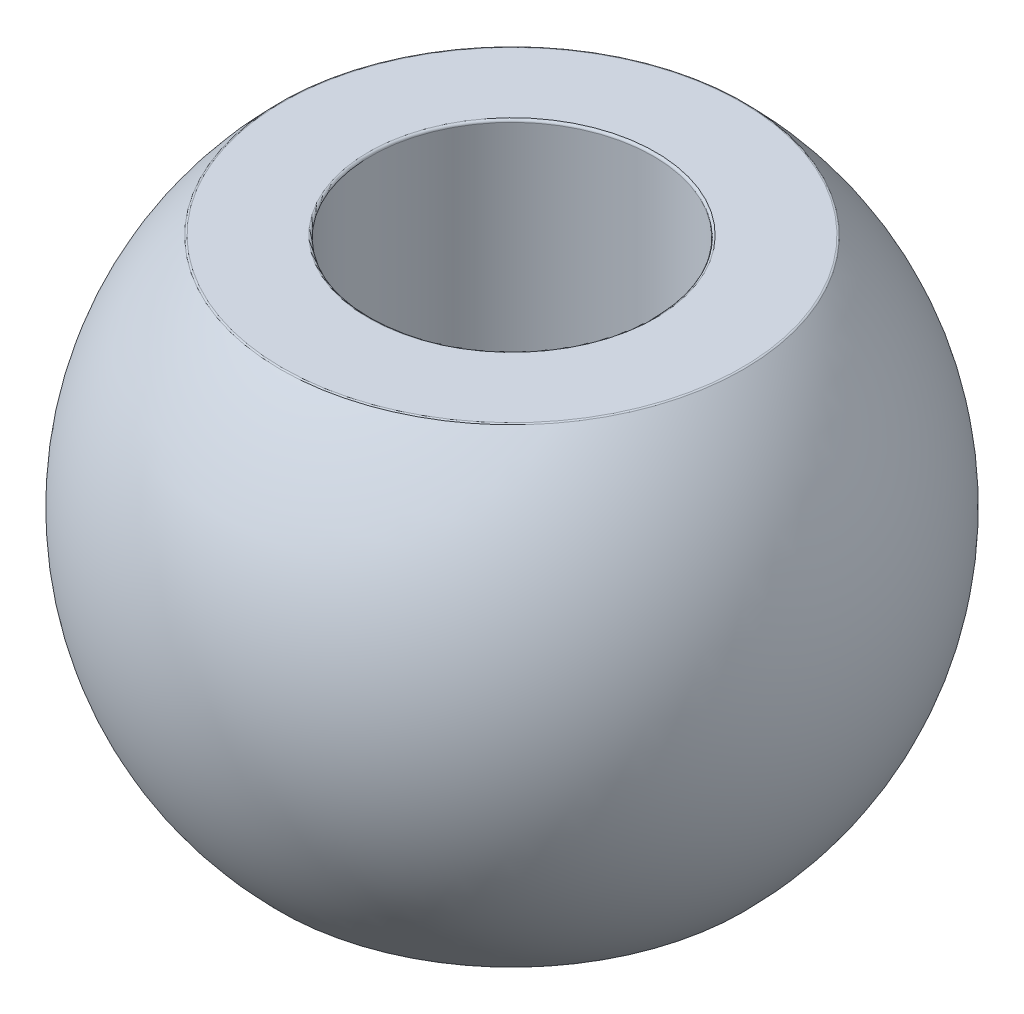
ISO-10303-21;
HEADER;
FILE_DESCRIPTION(('STEP AP214'),'2;1');
FILE_NAME('part.step','',(''),(''),'','','');
FILE_SCHEMA(('AUTOMOTIVE_DESIGN { 1 0 10303 214 1 1 1 1 }'));
ENDSEC;
DATA;
#1=APPLICATION_CONTEXT('core data for automotive mechanical design processes');
#2=APPLICATION_PROTOCOL_DEFINITION('international standard','automotive_design',2000,#1);
#3=PRODUCT_CONTEXT('',#1,'mechanical');
#4=PRODUCT('Part','Part','',(#3));
#5=PRODUCT_RELATED_PRODUCT_CATEGORY('part','',(#4));
#6=PRODUCT_DEFINITION_FORMATION('','',#4);
#7=PRODUCT_DEFINITION_CONTEXT('part definition',#1,'design');
#8=PRODUCT_DEFINITION('design','',#6,#7);
#9=PRODUCT_DEFINITION_SHAPE('','',#8);
#10=(LENGTH_UNIT() NAMED_UNIT(*) SI_UNIT(.MILLI.,.METRE.));
#11=(NAMED_UNIT(*) PLANE_ANGLE_UNIT() SI_UNIT($,.RADIAN.));
#12=(NAMED_UNIT(*) SI_UNIT($,.STERADIAN.) SOLID_ANGLE_UNIT());
#13=UNCERTAINTY_MEASURE_WITH_UNIT(LENGTH_MEASURE(1.E-05),#10,'distance_accuracy_value','');
#14=(GEOMETRIC_REPRESENTATION_CONTEXT(3) GLOBAL_UNCERTAINTY_ASSIGNED_CONTEXT((#13)) GLOBAL_UNIT_ASSIGNED_CONTEXT((#10,
#11,#12)) REPRESENTATION_CONTEXT('',''));
#15=CARTESIAN_POINT('',(0.,0.,0.));
#16=DIRECTION('',(0.,0.,1.));
#17=DIRECTION('',(1.,0.,0.));
#18=AXIS2_PLACEMENT_3D('',#15,#16,#17);
#19=CARTESIAN_POINT('',(6.,-10.,0.));
#20=DIRECTION('',(0.,-1.,0.));
#21=DIRECTION('',(0.,0.,-1.));
#22=AXIS2_PLACEMENT_3D('',#19,#20,#21);
#23=PLANE('',#22);
#24=CARTESIAN_POINT('',(0.,-10.,0.));
#25=DIRECTION('',(0.,-1.,0.));
#26=DIRECTION('',(0.,0.,-1.));
#27=AXIS2_PLACEMENT_3D('',#24,#25,#26);
#28=CIRCLE('',#27,9.75704873412037);
#29=CARTESIAN_POINT('',(0.,-10.,-9.75704873412037));
#30=VERTEX_POINT('',#29);
#31=EDGE_CURVE('E58',#30,#30,#28,.T.);
#32=ORIENTED_EDGE('',*,*,#31,.T.);
#33=EDGE_LOOP('',(#32));
#34=FACE_BOUND('',#33,.T.);
#35=CARTESIAN_POINT('',(0.,-10.,0.));
#36=DIRECTION('',(0.,-1.,0.));
#37=DIRECTION('',(0.,0.,-1.));
#38=AXIS2_PLACEMENT_3D('',#35,#36,#37);
#39=CIRCLE('',#38,6.1);
#40=CARTESIAN_POINT('',(0.,-10.,-6.1));
#41=VERTEX_POINT('',#40);
#42=EDGE_CURVE('E61',#41,#41,#39,.F.);
#43=ORIENTED_EDGE('',*,*,#42,.T.);
#44=EDGE_LOOP('',(#43));
#45=FACE_BOUND('',#44,.T.);
#46=ADVANCED_FACE('F32',(#34,#45),#23,.T.);
#47=CARTESIAN_POINT('',(0.,0.,0.));
#48=DIRECTION('',(0.,-1.,0.));
#49=DIRECTION('',(0.,0.,-1.));
#50=AXIS2_PLACEMENT_3D('',#47,#48,#49);
#51=CYLINDRICAL_SURFACE('',#50,6.);
#52=CARTESIAN_POINT('',(0.,9.9,0.));
#53=DIRECTION('',(0.,1.,0.));
#54=DIRECTION('',(0.,0.,1.));
#55=AXIS2_PLACEMENT_3D('',#52,#53,#54);
#56=CIRCLE('',#55,6.);
#57=CARTESIAN_POINT('',(0.,9.9,6.));
#58=VERTEX_POINT('',#57);
#59=EDGE_CURVE('E10',#58,#58,#56,.T.);
#60=ORIENTED_EDGE('',*,*,#59,.T.);
#61=EDGE_LOOP('',(#60));
#62=FACE_BOUND('',#61,.T.);
#63=CARTESIAN_POINT('',(0.,-9.9,0.));
#64=DIRECTION('',(0.,-1.,0.));
#65=DIRECTION('',(0.,0.,-1.));
#66=AXIS2_PLACEMENT_3D('',#63,#64,#65);
#67=CIRCLE('',#66,6.);
#68=CARTESIAN_POINT('',(0.,-9.9,-6.));
#69=VERTEX_POINT('',#68);
#70=EDGE_CURVE('E39',#69,#69,#67,.T.);
#71=ORIENTED_EDGE('',*,*,#70,.T.);
#72=EDGE_LOOP('',(#71));
#73=FACE_BOUND('',#72,.T.);
#74=ADVANCED_FACE('F75',(#62,#73),#51,.F.);
#75=CARTESIAN_POINT('',(6.,10.,0.));
#76=DIRECTION('',(0.,1.,0.));
#77=DIRECTION('',(0.,0.,1.));
#78=AXIS2_PLACEMENT_3D('',#75,#76,#77);
#79=PLANE('',#78);
#80=CARTESIAN_POINT('',(0.,10.,0.));
#81=DIRECTION('',(0.,1.,0.));
#82=DIRECTION('',(0.,0.,1.));
#83=AXIS2_PLACEMENT_3D('',#80,#81,#82);
#84=CIRCLE('',#83,9.75704873412037);
#85=CARTESIAN_POINT('',(0.,10.,9.75704873412037));
#86=VERTEX_POINT('',#85);
#87=EDGE_CURVE('E43',#86,#86,#84,.T.);
#88=ORIENTED_EDGE('',*,*,#87,.T.);
#89=EDGE_LOOP('',(#88));
#90=FACE_BOUND('',#89,.T.);
#91=CARTESIAN_POINT('',(0.,10.,0.));
#92=DIRECTION('',(0.,1.,0.));
#93=DIRECTION('',(0.,0.,1.));
#94=AXIS2_PLACEMENT_3D('',#91,#92,#93);
#95=CIRCLE('',#94,6.1);
#96=CARTESIAN_POINT('',(0.,10.,6.1));
#97=VERTEX_POINT('',#96);
#98=EDGE_CURVE('E47',#97,#97,#95,.F.);
#99=ORIENTED_EDGE('',*,*,#98,.T.);
#100=EDGE_LOOP('',(#99));
#101=FACE_BOUND('',#100,.T.);
#102=ADVANCED_FACE('F81',(#90,#101),#79,.T.);
#103=CARTESIAN_POINT('',(0.,0.,0.));
#104=DIRECTION('',(0.,-1.,0.));
#105=DIRECTION('',(1.,0.,0.));
#106=AXIS2_PLACEMENT_3D('',#103,#104,#105);
#107=SPHERICAL_SURFACE('',#106,14.);
#108=CARTESIAN_POINT('',(0.,-9.97122302158274,0.));
#109=DIRECTION('',(0.,1.,0.));
#110=DIRECTION('',(0.,0.,1.));
#111=AXIS2_PLACEMENT_3D('',#108,#109,#110);
#112=CIRCLE('',#111,9.82724332932987);
#113=CARTESIAN_POINT('',(9.82724332932987,-9.97122302158274,0.));
#114=VERTEX_POINT('',#113);
#115=EDGE_CURVE('E52',#114,#114,#112,.T.);
#116=CARTESIAN_POINT('',(0.,9.97122302158274,0.));
#117=DIRECTION('',(0.,-1.,0.));
#118=DIRECTION('',(0.,0.,-1.));
#119=AXIS2_PLACEMENT_3D('',#116,#117,#118);
#120=CIRCLE('',#119,9.82724332932987);
#121=CARTESIAN_POINT('',(9.82724332932987,9.97122302158274,0.));
#122=VERTEX_POINT('',#121);
#123=EDGE_CURVE('E55',#122,#122,#120,.T.);
#124=CARTESIAN_POINT('',(9.82724332932987,-9.97122302158274,0.));
#125=CARTESIAN_POINT('',(9.9919114646545,-9.80893969402011,0.));
#126=CARTESIAN_POINT('',(10.1525523432663,-9.64257072291391,0.));
#127=CARTESIAN_POINT('',(10.4654017102896,-9.30208474097505,0.));
#128=CARTESIAN_POINT('',(10.6176101987009,-9.12796773014239,0.));
#129=CARTESIAN_POINT('',(10.9132169085482,-8.77240891611131,0.));
#130=CARTESIAN_POINT('',(11.0566151299842,-8.59096711291288,0.));
#131=CARTESIAN_POINT('',(11.3342505930593,-8.22120503028844,0.));
#132=CARTESIAN_POINT('',(11.4684878346985,-8.03288475086242,0.));
#133=CARTESIAN_POINT('',(11.7274716198275,-7.64982754593066,0.));
#134=CARTESIAN_POINT('',(11.8522181633174,-7.45509062042492,0.));
#135=CARTESIAN_POINT('',(12.091914521068,-7.05967806503979,0.));
#136=CARTESIAN_POINT('',(12.2068643353289,-6.8590024351604,0.));
#137=CARTESIAN_POINT('',(12.4266851370452,-6.45220488769731,0.));
#138=CARTESIAN_POINT('',(12.5315561245007,-6.24608297011361,0.));
#139=CARTESIAN_POINT('',(12.7309619360161,-5.82889865480269,0.));
#140=CARTESIAN_POINT('',(12.825496760076,-5.61783625707548,0.));
#141=CARTESIAN_POINT('',(13.003998264435,-5.19128890543252,0.));
#142=CARTESIAN_POINT('',(13.0879649447341,-4.97580395151677,0.));
#143=CARTESIAN_POINT('',(13.2451241163975,-4.5409402658357,0.));
#144=CARTESIAN_POINT('',(13.3183166077617,-4.32156153407039,0.));
#145=CARTESIAN_POINT('',(13.4537477945843,-3.87944862545482,0.));
#146=CARTESIAN_POINT('',(13.5159864900426,-3.65671444860455,0.));
#147=CARTESIAN_POINT('',(13.6293573577195,-3.20843721663661,0.));
#148=CARTESIAN_POINT('',(13.680489529938,-2.98289416151892,0.));
#149=CARTESIAN_POINT('',(13.771521878029,-2.52955263249611,0.));
#150=CARTESIAN_POINT('',(13.8114220539015,-2.30175415859097,0.));
#151=CARTESIAN_POINT('',(13.87989249837,-1.84446078604894,0.));
#152=CARTESIAN_POINT('',(13.908462766966,-1.61496588741205,0.));
#153=CARTESIAN_POINT('',(13.9542032883766,-1.15484282231164,0.));
#154=CARTESIAN_POINT('',(13.9713735411913,-0.924214655848108,0.));
#155=CARTESIAN_POINT('',(13.994271897003,-0.462390992923054,0.));
#156=CARTESIAN_POINT('',(14.,-0.231195496461527,0.));
#157=CARTESIAN_POINT('',(14.,0.231195496461527,0.));
#158=CARTESIAN_POINT('',(13.994271897003,0.462390992923054,0.));
#159=CARTESIAN_POINT('',(13.9713735411913,0.924214655848108,0.));
#160=CARTESIAN_POINT('',(13.9542032883766,1.15484282231164,0.));
#161=CARTESIAN_POINT('',(13.908462766966,1.61496588741205,0.));
#162=CARTESIAN_POINT('',(13.87989249837,1.84446078604894,0.));
#163=CARTESIAN_POINT('',(13.8114220539015,2.30175415859097,0.));
#164=CARTESIAN_POINT('',(13.771521878029,2.52955263249611,0.));
#165=CARTESIAN_POINT('',(13.680489529938,2.98289416151892,0.));
#166=CARTESIAN_POINT('',(13.6293573577195,3.20843721663661,0.));
#167=CARTESIAN_POINT('',(13.5159864900426,3.65671444860455,0.));
#168=CARTESIAN_POINT('',(13.4537477945843,3.87944862545482,0.));
#169=CARTESIAN_POINT('',(13.3183166077617,4.32156153407039,0.));
#170=CARTESIAN_POINT('',(13.2451241163975,4.5409402658357,0.));
#171=CARTESIAN_POINT('',(13.0879649447341,4.97580395151677,0.));
#172=CARTESIAN_POINT('',(13.003998264435,5.19128890543252,0.));
#173=CARTESIAN_POINT('',(12.825496760076,5.61783625707548,0.));
#174=CARTESIAN_POINT('',(12.7309619360161,5.82889865480269,0.));
#175=CARTESIAN_POINT('',(12.5315561245007,6.24608297011361,0.));
#176=CARTESIAN_POINT('',(12.4266851370452,6.45220488769731,0.));
#177=CARTESIAN_POINT('',(12.2068643353289,6.8590024351604,0.));
#178=CARTESIAN_POINT('',(12.091914521068,7.05967806503979,0.));
#179=CARTESIAN_POINT('',(11.8522181633174,7.45509062042492,0.));
#180=CARTESIAN_POINT('',(11.7274716198275,7.64982754593066,0.));
#181=CARTESIAN_POINT('',(11.4684878346985,8.03288475086242,0.));
#182=CARTESIAN_POINT('',(11.3342505930593,8.22120503028844,0.));
#183=CARTESIAN_POINT('',(11.0566151299842,8.59096711291288,0.));
#184=CARTESIAN_POINT('',(10.9132169085482,8.77240891611131,0.));
#185=CARTESIAN_POINT('',(10.6176101987009,9.12796773014239,0.));
#186=CARTESIAN_POINT('',(10.4654017102896,9.30208474097505,0.));
#187=CARTESIAN_POINT('',(10.1525523432663,9.64257072291391,0.));
#188=CARTESIAN_POINT('',(9.9919114646545,9.80893969402011,0.));
#189=CARTESIAN_POINT('',(9.82724332932987,9.97122302158274,0.));
#190=B_SPLINE_CURVE_WITH_KNOTS('',3,(#124,#125,#126,#127,#128,#129,#130,#131,#132,#133,#134,
#135,#136,#137,#138,#139,#140,#141,#142,#143,#144,#145,#146,#147,#148,#149,#150,#151,#152,#153,
#154,#155,#156,#157,#158,#159,#160,#161,#162,#163,#164,#165,#166,#167,#168,#169,#170,#171,#172,
#173,#174,#175,#176,#177,#178,#179,#180,#181,#182,#183,#184,#185,#186,#187,#188,#189),
.UNSPECIFIED.,.F.,.F.,(4,2,2,2,2,2,2,2,2,2,2,2,2,2,2,2,2,2,2,2,2,2,2,2,2,2,2,2,2,2,2,2,4),(0.,
0.69351558402118,1.38703116804236,2.08054675206354,2.77406233608472,3.4675779201059,
4.16109350412709,4.85460908814826,5.54812467216945,6.24164025619063,6.93515584021181,
7.62867142423299,8.32218700825417,9.01570259227535,9.70921817629653,10.4027337603177,
11.0962493443389,11.7897649283601,12.4832805123813,13.1767960964024,13.8703116804236,
14.5638272644448,15.257342848466,15.9508584324872,16.6443740165083,17.3378896005295,
18.0314051845507,18.7249207685719,19.4184363525931,20.1119519366142,20.8054675206354,
21.4989831046566,22.1924986886778),.UNSPECIFIED.);
#191=EDGE_CURVE('BSEAM88',#114,#122,#190,.T.);
#192=ORIENTED_EDGE('',*,*,#115,.T.);
#193=ORIENTED_EDGE('',*,*,#123,.T.);
#194=ORIENTED_EDGE('',*,*,#191,.T.);
#195=ORIENTED_EDGE('',*,*,#191,.F.);
#196=EDGE_LOOP('',(#192,#194,#193,#195));
#197=FACE_BOUND('',#196,.T.);
#198=ADVANCED_FACE('F88',(#197),#107,.T.);
#199=CARTESIAN_POINT('',(0.,-9.9,0.));
#200=DIRECTION('',(0.,-1.,0.));
#201=DIRECTION('',(0.,0.,-1.));
#202=AXIS2_PLACEMENT_3D('',#199,#200,#201);
#203=TOROIDAL_SURFACE('',#202,9.75704873412037,0.1);
#204=ORIENTED_EDGE('',*,*,#115,.F.);
#205=EDGE_LOOP('',(#204));
#206=FACE_BOUND('',#205,.T.);
#207=ORIENTED_EDGE('',*,*,#31,.F.);
#208=EDGE_LOOP('',(#207));
#209=FACE_BOUND('',#208,.T.);
#210=ADVANCED_FACE('F85',(#206,#209),#203,.T.);
#211=CARTESIAN_POINT('',(0.,9.9,0.));
#212=DIRECTION('',(0.,1.,0.));
#213=DIRECTION('',(0.,0.,1.));
#214=AXIS2_PLACEMENT_3D('',#211,#212,#213);
#215=TOROIDAL_SURFACE('',#214,9.75704873412037,0.1);
#216=ORIENTED_EDGE('',*,*,#87,.F.);
#217=EDGE_LOOP('',(#216));
#218=FACE_BOUND('',#217,.T.);
#219=ORIENTED_EDGE('',*,*,#123,.F.);
#220=EDGE_LOOP('',(#219));
#221=FACE_BOUND('',#220,.T.);
#222=ADVANCED_FACE('F72',(#218,#221),#215,.T.);
#223=CARTESIAN_POINT('',(0.,9.9,0.));
#224=DIRECTION('',(0.,1.,0.));
#225=DIRECTION('',(0.,0.,1.));
#226=AXIS2_PLACEMENT_3D('',#223,#224,#225);
#227=TOROIDAL_SURFACE('',#226,6.1,0.1);
#228=ORIENTED_EDGE('',*,*,#59,.F.);
#229=EDGE_LOOP('',(#228));
#230=FACE_BOUND('',#229,.T.);
#231=ORIENTED_EDGE('',*,*,#98,.F.);
#232=EDGE_LOOP('',(#231));
#233=FACE_BOUND('',#232,.T.);
#234=ADVANCED_FACE('F68',(#230,#233),#227,.T.);
#235=CARTESIAN_POINT('',(0.,-9.9,0.));
#236=DIRECTION('',(0.,-1.,0.));
#237=DIRECTION('',(0.,0.,-1.));
#238=AXIS2_PLACEMENT_3D('',#235,#236,#237);
#239=TOROIDAL_SURFACE('',#238,6.1,0.1);
#240=ORIENTED_EDGE('',*,*,#42,.F.);
#241=EDGE_LOOP('',(#240));
#242=FACE_BOUND('',#241,.T.);
#243=ORIENTED_EDGE('',*,*,#70,.F.);
#244=EDGE_LOOP('',(#243));
#245=FACE_BOUND('',#244,.T.);
#246=ADVANCED_FACE('F34',(#242,#245),#239,.T.);
#247=CLOSED_SHELL('',(#46,#74,#102,#198,#210,#222,#234,#246));
#248=MANIFOLD_SOLID_BREP('B2',#247);
#249=ADVANCED_BREP_SHAPE_REPRESENTATION('',(#18,#248),#14);
#250=SHAPE_DEFINITION_REPRESENTATION(#9,#249);
ENDSEC;
END-ISO-10303-21;
